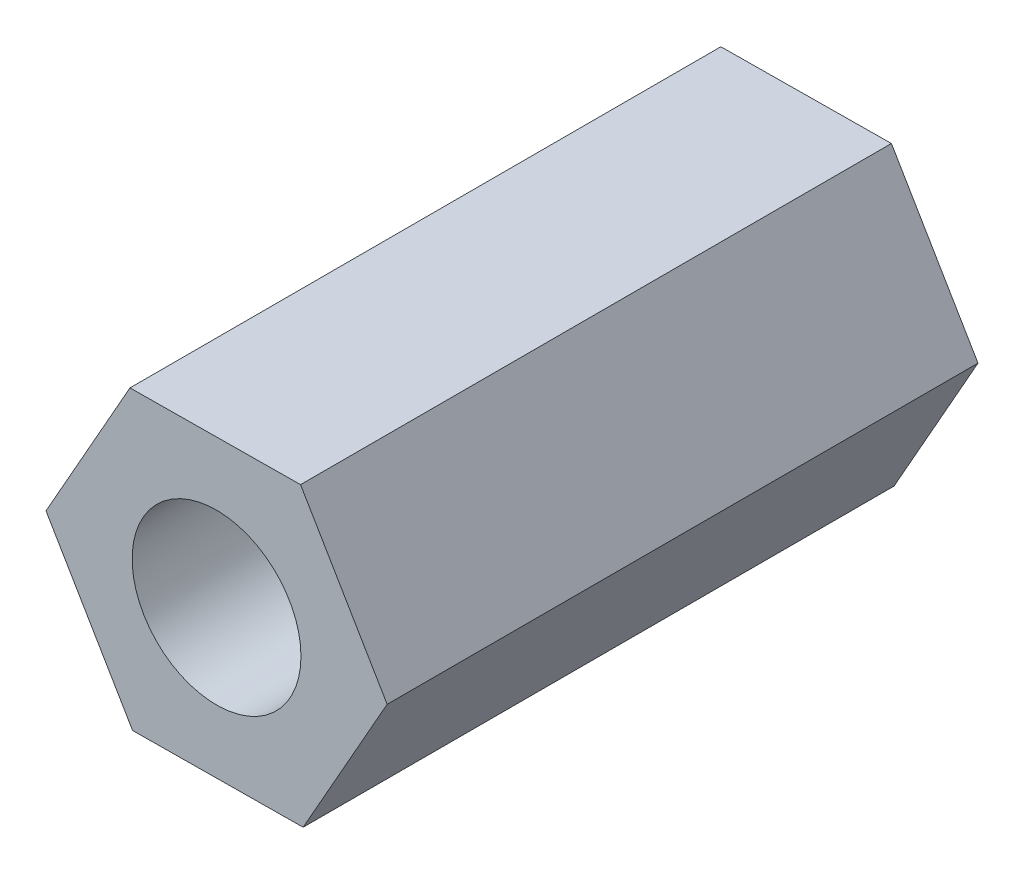
ISO-10303-21;
HEADER;
FILE_DESCRIPTION(('STEP AP214'),'2;1');
FILE_NAME('part.step','',(''),(''),'','','');
FILE_SCHEMA(('AUTOMOTIVE_DESIGN { 1 0 10303 214 1 1 1 1 }'));
ENDSEC;
DATA;
#1=APPLICATION_CONTEXT('core data for automotive mechanical design processes');
#2=APPLICATION_PROTOCOL_DEFINITION('international standard','automotive_design',2000,#1);
#3=PRODUCT_CONTEXT('',#1,'mechanical');
#4=PRODUCT('Part','Part','',(#3));
#5=PRODUCT_RELATED_PRODUCT_CATEGORY('part','',(#4));
#6=PRODUCT_DEFINITION_FORMATION('','',#4);
#7=PRODUCT_DEFINITION_CONTEXT('part definition',#1,'design');
#8=PRODUCT_DEFINITION('design','',#6,#7);
#9=PRODUCT_DEFINITION_SHAPE('','',#8);
#10=(LENGTH_UNIT() NAMED_UNIT(*) SI_UNIT(.MILLI.,.METRE.));
#11=(NAMED_UNIT(*) PLANE_ANGLE_UNIT() SI_UNIT($,.RADIAN.));
#12=(NAMED_UNIT(*) SI_UNIT($,.STERADIAN.) SOLID_ANGLE_UNIT());
#13=UNCERTAINTY_MEASURE_WITH_UNIT(LENGTH_MEASURE(1.E-05),#10,'distance_accuracy_value','');
#14=(GEOMETRIC_REPRESENTATION_CONTEXT(3) GLOBAL_UNCERTAINTY_ASSIGNED_CONTEXT((#13)) GLOBAL_UNIT_ASSIGNED_CONTEXT((#10,
#11,#12)) REPRESENTATION_CONTEXT('',''));
#15=CARTESIAN_POINT('',(0.,0.,0.));
#16=DIRECTION('',(0.,0.,1.));
#17=DIRECTION('',(1.,0.,0.));
#18=AXIS2_PLACEMENT_3D('',#15,#16,#17);
#19=CARTESIAN_POINT('',(0.,0.,14.));
#20=DIRECTION('',(0.,0.,1.));
#21=DIRECTION('',(1.,0.,0.));
#22=AXIS2_PLACEMENT_3D('',#19,#20,#21);
#23=PLANE('',#22);
#24=DIRECTION('',(0.999961257640527,0.00880245522430722,0.));
#25=VECTOR('',#24,1.);
#26=CARTESIAN_POINT('',(-1.98983906118775,-3.51765175136834,14.));
#27=LINE('',#26,#25);
#28=CARTESIAN_POINT('',(-1.98983906118775,-3.51765175136834,14.));
#29=VERTEX_POINT('',#28);
#30=CARTESIAN_POINT('',(2.05145624775792,-3.48207705211536,14.));
#31=VERTEX_POINT('',#30);
#32=EDGE_CURVE('E146',#29,#31,#27,.T.);
#33=ORIENTED_EDGE('',*,*,#32,.T.);
#34=DIRECTION('',(0.492357478980338,0.870393079529086,0.));
#35=VECTOR('',#34,1.);
#36=CARTESIAN_POINT('',(2.05145624775792,-3.48207705211536,14.));
#37=LINE('',#36,#35);
#38=CARTESIAN_POINT('',(4.04129530894568,0.0355746992529791,14.));
#39=VERTEX_POINT('',#38);
#40=EDGE_CURVE('E94',#31,#39,#37,.T.);
#41=ORIENTED_EDGE('',*,*,#40,.T.);
#42=DIRECTION('',(-0.507603778660189,0.861590624304779,0.));
#43=VECTOR('',#42,1.);
#44=CARTESIAN_POINT('',(4.04129530894568,0.0355746992529791,14.));
#45=LINE('',#44,#43);
#46=CARTESIAN_POINT('',(1.98983906118776,3.51765175136834,14.));
#47=VERTEX_POINT('',#46);
#48=EDGE_CURVE('E107',#39,#47,#45,.T.);
#49=ORIENTED_EDGE('',*,*,#48,.T.);
#50=DIRECTION('',(-0.999961257640527,-0.00880245522430723,0.));
#51=VECTOR('',#50,1.);
#52=CARTESIAN_POINT('',(1.98983906118776,3.51765175136834,14.));
#53=LINE('',#52,#51);
#54=CARTESIAN_POINT('',(-2.05145624775791,3.48207705211536,14.));
#55=VERTEX_POINT('',#54);
#56=EDGE_CURVE('E101',#47,#55,#53,.T.);
#57=ORIENTED_EDGE('',*,*,#56,.T.);
#58=DIRECTION('',(-0.492357478980338,-0.870393079529086,0.));
#59=VECTOR('',#58,1.);
#60=CARTESIAN_POINT('',(-2.05145624775791,3.48207705211536,14.));
#61=LINE('',#60,#59);
#62=CARTESIAN_POINT('',(-4.04129530894568,-0.0355746992529825,14.));
#63=VERTEX_POINT('',#62);
#64=EDGE_CURVE('E105',#55,#63,#61,.T.);
#65=ORIENTED_EDGE('',*,*,#64,.T.);
#66=DIRECTION('',(0.507603778660189,-0.861590624304779,0.));
#67=VECTOR('',#66,1.);
#68=CARTESIAN_POINT('',(-4.04129530894568,-0.0355746992529825,14.));
#69=LINE('',#68,#67);
#70=EDGE_CURVE('E57',#63,#29,#69,.T.);
#71=ORIENTED_EDGE('',*,*,#70,.T.);
#72=EDGE_LOOP('',(#33,#41,#49,#57,#65,#71));
#73=FACE_BOUND('',#72,.T.);
#74=CARTESIAN_POINT('',(0.,0.,14.));
#75=DIRECTION('',(0.,0.,1.));
#76=DIRECTION('',(1.,0.,0.));
#77=AXIS2_PLACEMENT_3D('',#74,#75,#76);
#78=CIRCLE('',#77,2.);
#79=CARTESIAN_POINT('',(2.,0.,14.));
#80=VERTEX_POINT('',#79);
#81=EDGE_CURVE('E134',#80,#80,#78,.T.);
#82=ORIENTED_EDGE('',*,*,#81,.F.);
#83=EDGE_LOOP('',(#82));
#84=FACE_BOUND('',#83,.T.);
#85=ADVANCED_FACE('F39',(#73,#84),#23,.T.);
#86=CARTESIAN_POINT('',(0.,0.,0.));
#87=DIRECTION('',(0.,0.,1.));
#88=DIRECTION('',(1.,0.,0.));
#89=AXIS2_PLACEMENT_3D('',#86,#87,#88);
#90=PLANE('',#89);
#91=DIRECTION('',(0.999961257640527,0.00880245522430722,0.));
#92=VECTOR('',#91,1.);
#93=CARTESIAN_POINT('',(-1.98983906118775,-3.51765175136834,0.));
#94=LINE('',#93,#92);
#95=CARTESIAN_POINT('',(-1.98983906118775,-3.51765175136834,0.));
#96=VERTEX_POINT('',#95);
#97=CARTESIAN_POINT('',(2.05145624775792,-3.48207705211536,0.));
#98=VERTEX_POINT('',#97);
#99=EDGE_CURVE('E129',#96,#98,#94,.T.);
#100=ORIENTED_EDGE('',*,*,#99,.F.);
#101=DIRECTION('',(0.507603778660189,-0.861590624304779,0.));
#102=VECTOR('',#101,1.);
#103=CARTESIAN_POINT('',(-4.04129530894568,-0.0355746992529825,0.));
#104=LINE('',#103,#102);
#105=CARTESIAN_POINT('',(-4.04129530894568,-0.0355746992529825,0.));
#106=VERTEX_POINT('',#105);
#107=EDGE_CURVE('E86',#106,#96,#104,.T.);
#108=ORIENTED_EDGE('',*,*,#107,.F.);
#109=DIRECTION('',(-0.492357478980338,-0.870393079529086,0.));
#110=VECTOR('',#109,1.);
#111=CARTESIAN_POINT('',(-2.05145624775791,3.48207705211536,0.));
#112=LINE('',#111,#110);
#113=CARTESIAN_POINT('',(-2.05145624775791,3.48207705211536,0.));
#114=VERTEX_POINT('',#113);
#115=EDGE_CURVE('E80',#114,#106,#112,.T.);
#116=ORIENTED_EDGE('',*,*,#115,.F.);
#117=DIRECTION('',(-0.999961257640527,-0.00880245522430723,0.));
#118=VECTOR('',#117,1.);
#119=CARTESIAN_POINT('',(1.98983906118776,3.51765175136834,0.));
#120=LINE('',#119,#118);
#121=CARTESIAN_POINT('',(1.98983906118776,3.51765175136834,0.));
#122=VERTEX_POINT('',#121);
#123=EDGE_CURVE('E116',#122,#114,#120,.T.);
#124=ORIENTED_EDGE('',*,*,#123,.F.);
#125=DIRECTION('',(-0.507603778660189,0.861590624304779,0.));
#126=VECTOR('',#125,1.);
#127=CARTESIAN_POINT('',(4.04129530894568,0.0355746992529791,0.));
#128=LINE('',#127,#126);
#129=CARTESIAN_POINT('',(4.04129530894568,0.0355746992529791,0.));
#130=VERTEX_POINT('',#129);
#131=EDGE_CURVE('E137',#130,#122,#128,.T.);
#132=ORIENTED_EDGE('',*,*,#131,.F.);
#133=DIRECTION('',(0.492357478980338,0.870393079529086,0.));
#134=VECTOR('',#133,1.);
#135=CARTESIAN_POINT('',(2.05145624775792,-3.48207705211536,0.));
#136=LINE('',#135,#134);
#137=EDGE_CURVE('E133',#98,#130,#136,.T.);
#138=ORIENTED_EDGE('',*,*,#137,.F.);
#139=EDGE_LOOP('',(#100,#108,#116,#124,#132,#138));
#140=FACE_BOUND('',#139,.T.);
#141=CARTESIAN_POINT('',(0.,0.,0.));
#142=DIRECTION('',(0.,0.,1.));
#143=DIRECTION('',(1.,0.,0.));
#144=AXIS2_PLACEMENT_3D('',#141,#142,#143);
#145=CIRCLE('',#144,2.);
#146=CARTESIAN_POINT('',(2.,0.,0.));
#147=VERTEX_POINT('',#146);
#148=EDGE_CURVE('E243',#147,#147,#145,.T.);
#149=ORIENTED_EDGE('',*,*,#148,.T.);
#150=EDGE_LOOP('',(#149));
#151=FACE_BOUND('',#150,.T.);
#152=ADVANCED_FACE('F159',(#140,#151),#90,.F.);
#153=CARTESIAN_POINT('',(-1.98983906118775,-3.51765175136834,14.));
#154=DIRECTION('',(-0.00880245522430722,0.999961257640527,0.));
#155=DIRECTION('',(-0.999961257640527,-0.00880245522430722,0.));
#156=AXIS2_PLACEMENT_3D('',#153,#154,#155);
#157=PLANE('',#156);
#158=ORIENTED_EDGE('',*,*,#99,.T.);
#159=DIRECTION('',(0.,0.,-1.));
#160=VECTOR('',#159,1.);
#161=CARTESIAN_POINT('',(2.05145624775792,-3.48207705211536,14.));
#162=LINE('',#161,#160);
#163=EDGE_CURVE('E11',#31,#98,#162,.T.);
#164=ORIENTED_EDGE('',*,*,#163,.F.);
#165=ORIENTED_EDGE('',*,*,#32,.F.);
#166=DIRECTION('',(0.,0.,-1.));
#167=VECTOR('',#166,1.);
#168=CARTESIAN_POINT('',(-1.98983906118775,-3.51765175136834,14.));
#169=LINE('',#168,#167);
#170=EDGE_CURVE('E125',#29,#96,#169,.T.);
#171=ORIENTED_EDGE('',*,*,#170,.T.);
#172=EDGE_LOOP('',(#158,#164,#165,#171));
#173=FACE_BOUND('',#172,.T.);
#174=ADVANCED_FACE('F41',(#173),#157,.F.);
#175=CARTESIAN_POINT('',(2.05145624775792,-3.48207705211536,14.));
#176=DIRECTION('',(-0.870393079529086,0.492357478980338,0.));
#177=DIRECTION('',(-0.492357478980338,-0.870393079529086,0.));
#178=AXIS2_PLACEMENT_3D('',#175,#176,#177);
#179=PLANE('',#178);
#180=ORIENTED_EDGE('',*,*,#137,.T.);
#181=DIRECTION('',(0.,0.,-1.));
#182=VECTOR('',#181,1.);
#183=CARTESIAN_POINT('',(4.04129530894568,0.0355746992529791,14.));
#184=LINE('',#183,#182);
#185=EDGE_CURVE('E49',#39,#130,#184,.T.);
#186=ORIENTED_EDGE('',*,*,#185,.F.);
#187=ORIENTED_EDGE('',*,*,#40,.F.);
#188=ORIENTED_EDGE('',*,*,#163,.T.);
#189=EDGE_LOOP('',(#180,#186,#187,#188));
#190=FACE_BOUND('',#189,.T.);
#191=ADVANCED_FACE('F184',(#190),#179,.F.);
#192=CARTESIAN_POINT('',(4.04129530894568,0.0355746992529791,14.));
#193=DIRECTION('',(-0.861590624304779,-0.507603778660189,0.));
#194=DIRECTION('',(0.507603778660189,-0.861590624304779,0.));
#195=AXIS2_PLACEMENT_3D('',#192,#193,#194);
#196=PLANE('',#195);
#197=ORIENTED_EDGE('',*,*,#131,.T.);
#198=DIRECTION('',(0.,0.,-1.));
#199=VECTOR('',#198,1.);
#200=CARTESIAN_POINT('',(1.98983906118776,3.51765175136834,14.));
#201=LINE('',#200,#199);
#202=EDGE_CURVE('E118',#47,#122,#201,.T.);
#203=ORIENTED_EDGE('',*,*,#202,.F.);
#204=ORIENTED_EDGE('',*,*,#48,.F.);
#205=ORIENTED_EDGE('',*,*,#185,.T.);
#206=EDGE_LOOP('',(#197,#203,#204,#205));
#207=FACE_BOUND('',#206,.T.);
#208=ADVANCED_FACE('F156',(#207),#196,.F.);
#209=CARTESIAN_POINT('',(1.98983906118776,3.51765175136834,14.));
#210=DIRECTION('',(0.00880245522430723,-0.999961257640527,0.));
#211=DIRECTION('',(0.999961257640527,0.00880245522430723,0.));
#212=AXIS2_PLACEMENT_3D('',#209,#210,#211);
#213=PLANE('',#212);
#214=ORIENTED_EDGE('',*,*,#123,.T.);
#215=DIRECTION('',(0.,0.,-1.));
#216=VECTOR('',#215,1.);
#217=CARTESIAN_POINT('',(-2.05145624775791,3.48207705211536,14.));
#218=LINE('',#217,#216);
#219=EDGE_CURVE('E113',#55,#114,#218,.T.);
#220=ORIENTED_EDGE('',*,*,#219,.F.);
#221=ORIENTED_EDGE('',*,*,#56,.F.);
#222=ORIENTED_EDGE('',*,*,#202,.T.);
#223=EDGE_LOOP('',(#214,#220,#221,#222));
#224=FACE_BOUND('',#223,.T.);
#225=ADVANCED_FACE('F114',(#224),#213,.F.);
#226=CARTESIAN_POINT('',(-2.05145624775791,3.48207705211536,14.));
#227=DIRECTION('',(0.870393079529086,-0.492357478980338,0.));
#228=DIRECTION('',(0.492357478980338,0.870393079529086,0.));
#229=AXIS2_PLACEMENT_3D('',#226,#227,#228);
#230=PLANE('',#229);
#231=ORIENTED_EDGE('',*,*,#115,.T.);
#232=DIRECTION('',(0.,0.,-1.));
#233=VECTOR('',#232,1.);
#234=CARTESIAN_POINT('',(-4.04129530894568,-0.0355746992529825,14.));
#235=LINE('',#234,#233);
#236=EDGE_CURVE('E119',#63,#106,#235,.T.);
#237=ORIENTED_EDGE('',*,*,#236,.F.);
#238=ORIENTED_EDGE('',*,*,#64,.F.);
#239=ORIENTED_EDGE('',*,*,#219,.T.);
#240=EDGE_LOOP('',(#231,#237,#238,#239));
#241=FACE_BOUND('',#240,.T.);
#242=ADVANCED_FACE('F121',(#241),#230,.F.);
#243=CARTESIAN_POINT('',(-4.04129530894568,-0.0355746992529825,14.));
#244=DIRECTION('',(0.861590624304779,0.507603778660189,0.));
#245=DIRECTION('',(-0.507603778660189,0.861590624304779,0.));
#246=AXIS2_PLACEMENT_3D('',#243,#244,#245);
#247=PLANE('',#246);
#248=ORIENTED_EDGE('',*,*,#107,.T.);
#249=ORIENTED_EDGE('',*,*,#170,.F.);
#250=ORIENTED_EDGE('',*,*,#70,.F.);
#251=ORIENTED_EDGE('',*,*,#236,.T.);
#252=EDGE_LOOP('',(#248,#249,#250,#251));
#253=FACE_BOUND('',#252,.T.);
#254=ADVANCED_FACE('F164',(#253),#247,.F.);
#255=CARTESIAN_POINT('',(0.,0.,14.));
#256=DIRECTION('',(0.,0.,-1.));
#257=DIRECTION('',(-1.,0.,0.));
#258=AXIS2_PLACEMENT_3D('',#255,#256,#257);
#259=CYLINDRICAL_SURFACE('',#258,2.);
#260=ORIENTED_EDGE('',*,*,#81,.T.);
#261=EDGE_LOOP('',(#260));
#262=FACE_BOUND('',#261,.T.);
#263=ORIENTED_EDGE('',*,*,#148,.F.);
#264=EDGE_LOOP('',(#263));
#265=FACE_BOUND('',#264,.T.);
#266=ADVANCED_FACE('F166',(#262,#265),#259,.F.);
#267=CLOSED_SHELL('',(#85,#152,#174,#191,#208,#225,#242,#254,#266));
#268=MANIFOLD_SOLID_BREP('B2',#267);
#269=ADVANCED_BREP_SHAPE_REPRESENTATION('',(#18,#268),#14);
#270=SHAPE_DEFINITION_REPRESENTATION(#9,#269);
ENDSEC;
END-ISO-10303-21;
